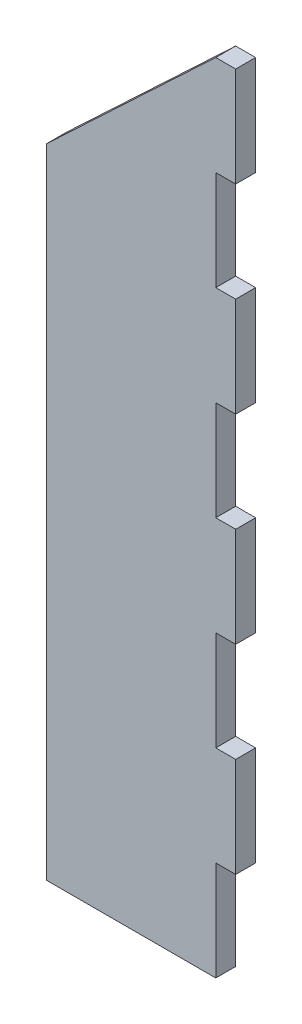
ISO-10303-21;
HEADER;
FILE_DESCRIPTION(('STEP AP214'),'2;1');
FILE_NAME('part.step','',(''),(''),'','','');
FILE_SCHEMA(('AUTOMOTIVE_DESIGN { 1 0 10303 214 1 1 1 1 }'));
ENDSEC;
DATA;
#1=APPLICATION_CONTEXT('core data for automotive mechanical design processes');
#2=APPLICATION_PROTOCOL_DEFINITION('international standard','automotive_design',2000,#1);
#3=PRODUCT_CONTEXT('',#1,'mechanical');
#4=PRODUCT('Part','Part','',(#3));
#5=PRODUCT_RELATED_PRODUCT_CATEGORY('part','',(#4));
#6=PRODUCT_DEFINITION_FORMATION('','',#4);
#7=PRODUCT_DEFINITION_CONTEXT('part definition',#1,'design');
#8=PRODUCT_DEFINITION('design','',#6,#7);
#9=PRODUCT_DEFINITION_SHAPE('','',#8);
#10=(LENGTH_UNIT() NAMED_UNIT(*) SI_UNIT(.MILLI.,.METRE.));
#11=(NAMED_UNIT(*) PLANE_ANGLE_UNIT() SI_UNIT($,.RADIAN.));
#12=(NAMED_UNIT(*) SI_UNIT($,.STERADIAN.) SOLID_ANGLE_UNIT());
#13=UNCERTAINTY_MEASURE_WITH_UNIT(LENGTH_MEASURE(1.E-05),#10,'distance_accuracy_value','');
#14=(GEOMETRIC_REPRESENTATION_CONTEXT(3) GLOBAL_UNCERTAINTY_ASSIGNED_CONTEXT((#13)) GLOBAL_UNIT_ASSIGNED_CONTEXT((#10,
#11,#12)) REPRESENTATION_CONTEXT('',''));
#15=CARTESIAN_POINT('',(0.,0.,0.));
#16=DIRECTION('',(0.,0.,1.));
#17=DIRECTION('',(1.,0.,0.));
#18=AXIS2_PLACEMENT_3D('',#15,#16,#17);
#19=CARTESIAN_POINT('',(-2.7755575615629E-13,25.3999999999997,6.35));
#20=DIRECTION('',(0.,1.,0.));
#21=DIRECTION('',(-1.,0.,0.));
#22=AXIS2_PLACEMENT_3D('',#19,#20,#21);
#23=PLANE('',#22);
#24=DIRECTION('',(1.,0.,0.));
#25=VECTOR('',#24,1.);
#26=CARTESIAN_POINT('',(-2.7755575615629E-13,25.3999999999997,0.));
#27=LINE('',#26,#25);
#28=CARTESIAN_POINT('',(26.9875,25.4,0.));
#29=VERTEX_POINT('',#28);
#30=CARTESIAN_POINT('',(33.337500000001,25.4,0.));
#31=VERTEX_POINT('',#30);
#32=EDGE_CURVE('E234',#29,#31,#27,.T.);
#33=ORIENTED_EDGE('',*,*,#32,.F.);
#34=DIRECTION('',(0.,0.,-1.));
#35=VECTOR('',#34,1.);
#36=CARTESIAN_POINT('',(26.9875,25.4,6.35));
#37=LINE('',#36,#35);
#38=CARTESIAN_POINT('',(26.9875,25.4,6.35));
#39=VERTEX_POINT('',#38);
#40=EDGE_CURVE('E11',#39,#29,#37,.T.);
#41=ORIENTED_EDGE('',*,*,#40,.F.);
#42=DIRECTION('',(1.,0.,0.));
#43=VECTOR('',#42,1.);
#44=CARTESIAN_POINT('',(-2.7755575615629E-13,25.3999999999997,6.35));
#45=LINE('',#44,#43);
#46=CARTESIAN_POINT('',(33.337500000001,25.4,6.35));
#47=VERTEX_POINT('',#46);
#48=EDGE_CURVE('E230',#39,#47,#45,.T.);
#49=ORIENTED_EDGE('',*,*,#48,.T.);
#50=DIRECTION('',(0.,0.,-1.));
#51=VECTOR('',#50,1.);
#52=CARTESIAN_POINT('',(33.337500000001,25.4,6.35));
#53=LINE('',#52,#51);
#54=EDGE_CURVE('E50',#47,#31,#53,.T.);
#55=ORIENTED_EDGE('',*,*,#54,.T.);
#56=EDGE_LOOP('',(#33,#41,#49,#55));
#57=FACE_BOUND('',#56,.T.);
#58=ADVANCED_FACE('F34',(#57),#23,.T.);
#59=CARTESIAN_POINT('',(26.9875,0.,6.35));
#60=DIRECTION('',(1.,0.,0.));
#61=DIRECTION('',(0.,1.,0.));
#62=AXIS2_PLACEMENT_3D('',#59,#60,#61);
#63=PLANE('',#62);
#64=DIRECTION('',(0.,-1.,0.));
#65=VECTOR('',#64,1.);
#66=CARTESIAN_POINT('',(26.9875,0.,0.));
#67=LINE('',#66,#65);
#68=CARTESIAN_POINT('',(26.9875,57.15,0.));
#69=VERTEX_POINT('',#68);
#70=EDGE_CURVE('E237',#69,#29,#67,.T.);
#71=ORIENTED_EDGE('',*,*,#70,.F.);
#72=DIRECTION('',(0.,0.,-1.));
#73=VECTOR('',#72,1.);
#74=CARTESIAN_POINT('',(26.9875,57.15,6.35));
#75=LINE('',#74,#73);
#76=CARTESIAN_POINT('',(26.9875,57.15,6.35));
#77=VERTEX_POINT('',#76);
#78=EDGE_CURVE('E42',#77,#69,#75,.T.);
#79=ORIENTED_EDGE('',*,*,#78,.F.);
#80=DIRECTION('',(0.,-1.,0.));
#81=VECTOR('',#80,1.);
#82=CARTESIAN_POINT('',(26.9875,0.,6.35));
#83=LINE('',#82,#81);
#84=EDGE_CURVE('E227',#77,#39,#83,.T.);
#85=ORIENTED_EDGE('',*,*,#84,.T.);
#86=ORIENTED_EDGE('',*,*,#40,.T.);
#87=EDGE_LOOP('',(#71,#79,#85,#86));
#88=FACE_BOUND('',#87,.T.);
#89=ADVANCED_FACE('F323',(#88),#63,.T.);
#90=CARTESIAN_POINT('',(-3.74700270810996E-13,57.1499999999998,6.35));
#91=DIRECTION('',(0.,1.,0.));
#92=DIRECTION('',(-1.,0.,0.));
#93=AXIS2_PLACEMENT_3D('',#90,#91,#92);
#94=PLANE('',#93);
#95=DIRECTION('',(1.,0.,0.));
#96=VECTOR('',#95,1.);
#97=CARTESIAN_POINT('',(-3.74700270810996E-13,57.1499999999998,0.));
#98=LINE('',#97,#96);
#99=CARTESIAN_POINT('',(33.3375000000006,57.15,0.));
#100=VERTEX_POINT('',#99);
#101=EDGE_CURVE('E242',#69,#100,#98,.T.);
#102=ORIENTED_EDGE('',*,*,#101,.T.);
#103=DIRECTION('',(0.,0.,-1.));
#104=VECTOR('',#103,1.);
#105=CARTESIAN_POINT('',(33.3375000000006,57.15,6.35));
#106=LINE('',#105,#104);
#107=CARTESIAN_POINT('',(33.3375000000006,57.15,6.35));
#108=VERTEX_POINT('',#107);
#109=EDGE_CURVE('E312',#108,#100,#106,.T.);
#110=ORIENTED_EDGE('',*,*,#109,.F.);
#111=DIRECTION('',(1.,0.,0.));
#112=VECTOR('',#111,1.);
#113=CARTESIAN_POINT('',(-3.74700270810996E-13,57.1499999999998,6.35));
#114=LINE('',#113,#112);
#115=EDGE_CURVE('E225',#77,#108,#114,.T.);
#116=ORIENTED_EDGE('',*,*,#115,.F.);
#117=ORIENTED_EDGE('',*,*,#78,.T.);
#118=EDGE_LOOP('',(#102,#110,#116,#117));
#119=FACE_BOUND('',#118,.T.);
#120=ADVANCED_FACE('F316',(#119),#94,.F.);
#121=CARTESIAN_POINT('',(33.3375000000005,0.,6.35));
#122=DIRECTION('',(1.,0.,0.));
#123=DIRECTION('',(0.,1.,0.));
#124=AXIS2_PLACEMENT_3D('',#121,#122,#123);
#125=PLANE('',#124);
#126=DIRECTION('',(0.,-1.,0.));
#127=VECTOR('',#126,1.);
#128=CARTESIAN_POINT('',(33.3375000000005,0.,0.));
#129=LINE('',#128,#127);
#130=CARTESIAN_POINT('',(33.3375000000003,88.9,0.));
#131=VERTEX_POINT('',#130);
#132=EDGE_CURVE('E249',#131,#100,#129,.T.);
#133=ORIENTED_EDGE('',*,*,#132,.F.);
#134=DIRECTION('',(0.,0.,-1.));
#135=VECTOR('',#134,1.);
#136=CARTESIAN_POINT('',(33.3375000000003,88.9,6.35));
#137=LINE('',#136,#135);
#138=CARTESIAN_POINT('',(33.3375000000003,88.9,6.35));
#139=VERTEX_POINT('',#138);
#140=EDGE_CURVE('E310',#139,#131,#137,.T.);
#141=ORIENTED_EDGE('',*,*,#140,.F.);
#142=DIRECTION('',(0.,-1.,0.));
#143=VECTOR('',#142,1.);
#144=CARTESIAN_POINT('',(33.3375000000005,0.,6.35));
#145=LINE('',#144,#143);
#146=EDGE_CURVE('E222',#139,#108,#145,.T.);
#147=ORIENTED_EDGE('',*,*,#146,.T.);
#148=ORIENTED_EDGE('',*,*,#109,.T.);
#149=EDGE_LOOP('',(#133,#141,#147,#148));
#150=FACE_BOUND('',#149,.T.);
#151=ADVANCED_FACE('F333',(#150),#125,.T.);
#152=CARTESIAN_POINT('',(-1.94289029309406E-13,88.8999999999999,6.35));
#153=DIRECTION('',(0.,1.,0.));
#154=DIRECTION('',(-1.,0.,0.));
#155=AXIS2_PLACEMENT_3D('',#152,#153,#154);
#156=PLANE('',#155);
#157=DIRECTION('',(1.,0.,0.));
#158=VECTOR('',#157,1.);
#159=CARTESIAN_POINT('',(-1.94289029309406E-13,88.8999999999999,0.));
#160=LINE('',#159,#158);
#161=CARTESIAN_POINT('',(26.9875,88.9,0.));
#162=VERTEX_POINT('',#161);
#163=EDGE_CURVE('E252',#162,#131,#160,.T.);
#164=ORIENTED_EDGE('',*,*,#163,.F.);
#165=DIRECTION('',(0.,0.,-1.));
#166=VECTOR('',#165,1.);
#167=CARTESIAN_POINT('',(26.9875,88.9,6.35));
#168=LINE('',#167,#166);
#169=CARTESIAN_POINT('',(26.9875,88.9,6.35));
#170=VERTEX_POINT('',#169);
#171=EDGE_CURVE('E308',#170,#162,#168,.T.);
#172=ORIENTED_EDGE('',*,*,#171,.F.);
#173=DIRECTION('',(1.,0.,0.));
#174=VECTOR('',#173,1.);
#175=CARTESIAN_POINT('',(-1.94289029309406E-13,88.8999999999999,6.35));
#176=LINE('',#175,#174);
#177=EDGE_CURVE('E219',#170,#139,#176,.T.);
#178=ORIENTED_EDGE('',*,*,#177,.T.);
#179=ORIENTED_EDGE('',*,*,#140,.T.);
#180=EDGE_LOOP('',(#164,#172,#178,#179));
#181=FACE_BOUND('',#180,.T.);
#182=ADVANCED_FACE('F338',(#181),#156,.T.);
#183=CARTESIAN_POINT('',(26.9875,120.65,0.));
#184=VERTEX_POINT('',#183);
#185=EDGE_CURVE('E244',#184,#162,#67,.T.);
#186=ORIENTED_EDGE('',*,*,#185,.F.);
#187=DIRECTION('',(0.,0.,-1.));
#188=VECTOR('',#187,1.);
#189=CARTESIAN_POINT('',(26.9875,120.65,6.35));
#190=LINE('',#189,#188);
#191=CARTESIAN_POINT('',(26.9875,120.65,6.35));
#192=VERTEX_POINT('',#191);
#193=EDGE_CURVE('E306',#192,#184,#190,.T.);
#194=ORIENTED_EDGE('',*,*,#193,.F.);
#195=EDGE_CURVE('E218',#192,#170,#83,.T.);
#196=ORIENTED_EDGE('',*,*,#195,.T.);
#197=ORIENTED_EDGE('',*,*,#171,.T.);
#198=EDGE_LOOP('',(#186,#194,#196,#197));
#199=FACE_BOUND('',#198,.T.);
#200=ADVANCED_FACE('F329',(#199),#63,.T.);
#201=CARTESIAN_POINT('',(-1.3183898417425E-12,120.65,6.35));
#202=DIRECTION('',(0.,1.,0.));
#203=DIRECTION('',(-1.,0.,0.));
#204=AXIS2_PLACEMENT_3D('',#201,#202,#203);
#205=PLANE('',#204);
#206=DIRECTION('',(1.,0.,0.));
#207=VECTOR('',#206,1.);
#208=CARTESIAN_POINT('',(-1.3183898417425E-12,120.65,0.));
#209=LINE('',#208,#207);
#210=CARTESIAN_POINT('',(33.3375,120.65,0.));
#211=VERTEX_POINT('',#210);
#212=EDGE_CURVE('E255',#184,#211,#209,.T.);
#213=ORIENTED_EDGE('',*,*,#212,.T.);
#214=DIRECTION('',(0.,0.,-1.));
#215=VECTOR('',#214,1.);
#216=CARTESIAN_POINT('',(33.3375,120.65,6.35));
#217=LINE('',#216,#215);
#218=CARTESIAN_POINT('',(33.3375,120.65,6.35));
#219=VERTEX_POINT('',#218);
#220=EDGE_CURVE('E304',#219,#211,#217,.T.);
#221=ORIENTED_EDGE('',*,*,#220,.F.);
#222=DIRECTION('',(1.,0.,0.));
#223=VECTOR('',#222,1.);
#224=CARTESIAN_POINT('',(-1.3183898417425E-12,120.65,6.35));
#225=LINE('',#224,#223);
#226=EDGE_CURVE('E216',#192,#219,#225,.T.);
#227=ORIENTED_EDGE('',*,*,#226,.F.);
#228=ORIENTED_EDGE('',*,*,#193,.T.);
#229=EDGE_LOOP('',(#213,#221,#227,#228));
#230=FACE_BOUND('',#229,.T.);
#231=ADVANCED_FACE('F337',(#230),#205,.F.);
#232=CARTESIAN_POINT('',(33.3374999999998,0.,6.35));
#233=DIRECTION('',(1.,0.,0.));
#234=DIRECTION('',(0.,1.,0.));
#235=AXIS2_PLACEMENT_3D('',#232,#233,#234);
#236=PLANE('',#235);
#237=DIRECTION('',(0.,-1.,0.));
#238=VECTOR('',#237,1.);
#239=CARTESIAN_POINT('',(33.3374999999998,0.,0.));
#240=LINE('',#239,#238);
#241=CARTESIAN_POINT('',(33.3375,152.4,0.));
#242=VERTEX_POINT('',#241);
#243=EDGE_CURVE('E258',#242,#211,#240,.T.);
#244=ORIENTED_EDGE('',*,*,#243,.F.);
#245=DIRECTION('',(0.,0.,-1.));
#246=VECTOR('',#245,1.);
#247=CARTESIAN_POINT('',(33.3375,152.4,6.35));
#248=LINE('',#247,#246);
#249=CARTESIAN_POINT('',(33.3375,152.4,6.35));
#250=VERTEX_POINT('',#249);
#251=EDGE_CURVE('E302',#250,#242,#248,.T.);
#252=ORIENTED_EDGE('',*,*,#251,.F.);
#253=DIRECTION('',(0.,-1.,0.));
#254=VECTOR('',#253,1.);
#255=CARTESIAN_POINT('',(33.3374999999998,0.,6.35));
#256=LINE('',#255,#254);
#257=EDGE_CURVE('E213',#250,#219,#256,.T.);
#258=ORIENTED_EDGE('',*,*,#257,.T.);
#259=ORIENTED_EDGE('',*,*,#220,.T.);
#260=EDGE_LOOP('',(#244,#252,#258,#259));
#261=FACE_BOUND('',#260,.T.);
#262=ADVANCED_FACE('F344',(#261),#236,.T.);
#263=CARTESIAN_POINT('',(0.,152.4,6.35));
#264=DIRECTION('',(0.,1.,0.));
#265=DIRECTION('',(0.,0.,1.));
#266=AXIS2_PLACEMENT_3D('',#263,#264,#265);
#267=PLANE('',#266);
#268=DIRECTION('',(1.,0.,0.));
#269=VECTOR('',#268,1.);
#270=CARTESIAN_POINT('',(0.,152.4,0.));
#271=LINE('',#270,#269);
#272=CARTESIAN_POINT('',(26.9875,152.4,0.));
#273=VERTEX_POINT('',#272);
#274=EDGE_CURVE('E261',#273,#242,#271,.T.);
#275=ORIENTED_EDGE('',*,*,#274,.F.);
#276=DIRECTION('',(0.,0.,-1.));
#277=VECTOR('',#276,1.);
#278=CARTESIAN_POINT('',(26.9875,152.4,6.35));
#279=LINE('',#278,#277);
#280=CARTESIAN_POINT('',(26.9875,152.4,6.35));
#281=VERTEX_POINT('',#280);
#282=EDGE_CURVE('E300',#281,#273,#279,.T.);
#283=ORIENTED_EDGE('',*,*,#282,.F.);
#284=DIRECTION('',(1.,0.,0.));
#285=VECTOR('',#284,1.);
#286=CARTESIAN_POINT('',(0.,152.4,6.35));
#287=LINE('',#286,#285);
#288=EDGE_CURVE('E210',#281,#250,#287,.T.);
#289=ORIENTED_EDGE('',*,*,#288,.T.);
#290=ORIENTED_EDGE('',*,*,#251,.T.);
#291=EDGE_LOOP('',(#275,#283,#289,#290));
#292=FACE_BOUND('',#291,.T.);
#293=ADVANCED_FACE('F393',(#292),#267,.T.);
#294=CARTESIAN_POINT('',(-63.3834862385321,67.3449541284404,6.35));
#295=DIRECTION('',(-0.685364699004991,0.728199992692803,0.));
#296=DIRECTION('',(-0.728199992692803,-0.685364699004991,0.));
#297=AXIS2_PLACEMENT_3D('',#294,#295,#296);
#298=PLANE('',#297);
#299=DIRECTION('',(0.728199992692803,0.685364699004991,0.));
#300=VECTOR('',#299,1.);
#301=CARTESIAN_POINT('',(-63.3834862385321,67.3449541284404,0.));
#302=LINE('',#301,#300);
#303=CARTESIAN_POINT('',(-26.9875,101.6,0.));
#304=VERTEX_POINT('',#303);
#305=EDGE_CURVE('E264',#304,#273,#302,.T.);
#306=ORIENTED_EDGE('',*,*,#305,.F.);
#307=DIRECTION('',(0.,0.,-1.));
#308=VECTOR('',#307,1.);
#309=CARTESIAN_POINT('',(-26.9875,101.6,6.35));
#310=LINE('',#309,#308);
#311=CARTESIAN_POINT('',(-26.9875,101.6,6.35));
#312=VERTEX_POINT('',#311);
#313=EDGE_CURVE('E298',#312,#304,#310,.T.);
#314=ORIENTED_EDGE('',*,*,#313,.F.);
#315=DIRECTION('',(0.728199992692803,0.685364699004991,0.));
#316=VECTOR('',#315,1.);
#317=CARTESIAN_POINT('',(-63.3834862385321,67.3449541284404,6.35));
#318=LINE('',#317,#316);
#319=EDGE_CURVE('E205',#312,#281,#318,.T.);
#320=ORIENTED_EDGE('',*,*,#319,.T.);
#321=ORIENTED_EDGE('',*,*,#282,.T.);
#322=EDGE_LOOP('',(#306,#314,#320,#321));
#323=FACE_BOUND('',#322,.T.);
#324=ADVANCED_FACE('F403',(#323),#298,.T.);
#325=CARTESIAN_POINT('',(-26.9875,0.,6.35));
#326=DIRECTION('',(-1.,0.,0.));
#327=DIRECTION('',(0.,-1.,0.));
#328=AXIS2_PLACEMENT_3D('',#325,#326,#327);
#329=PLANE('',#328);
#330=DIRECTION('',(0.,1.,0.));
#331=VECTOR('',#330,1.);
#332=CARTESIAN_POINT('',(-26.9875,0.,0.));
#333=LINE('',#332,#331);
#334=CARTESIAN_POINT('',(-26.9875,-101.6,0.));
#335=VERTEX_POINT('',#334);
#336=EDGE_CURVE('E267',#335,#304,#333,.T.);
#337=ORIENTED_EDGE('',*,*,#336,.F.);
#338=DIRECTION('',(0.,0.,-1.));
#339=VECTOR('',#338,1.);
#340=CARTESIAN_POINT('',(-26.9875,-101.6,6.35));
#341=LINE('',#340,#339);
#342=CARTESIAN_POINT('',(-26.9875,-101.6,6.35));
#343=VERTEX_POINT('',#342);
#344=EDGE_CURVE('E296',#343,#335,#341,.T.);
#345=ORIENTED_EDGE('',*,*,#344,.F.);
#346=DIRECTION('',(0.,1.,0.));
#347=VECTOR('',#346,1.);
#348=CARTESIAN_POINT('',(-26.9875,0.,6.35));
#349=LINE('',#348,#347);
#350=EDGE_CURVE('E201',#343,#312,#349,.T.);
#351=ORIENTED_EDGE('',*,*,#350,.T.);
#352=ORIENTED_EDGE('',*,*,#313,.T.);
#353=EDGE_LOOP('',(#337,#345,#351,#352));
#354=FACE_BOUND('',#353,.T.);
#355=ADVANCED_FACE('F413',(#354),#329,.T.);
#356=CARTESIAN_POINT('',(1.30614473485313E-13,-101.6,6.35));
#357=DIRECTION('',(0.,-1.,0.));
#358=DIRECTION('',(1.,0.,0.));
#359=AXIS2_PLACEMENT_3D('',#356,#357,#358);
#360=PLANE('',#359);
#361=DIRECTION('',(-1.,0.,0.));
#362=VECTOR('',#361,1.);
#363=CARTESIAN_POINT('',(1.30614473485313E-13,-101.6,0.));
#364=LINE('',#363,#362);
#365=CARTESIAN_POINT('',(26.9875,-101.6,0.));
#366=VERTEX_POINT('',#365);
#367=EDGE_CURVE('E270',#366,#335,#364,.T.);
#368=ORIENTED_EDGE('',*,*,#367,.F.);
#369=DIRECTION('',(0.,0.,-1.));
#370=VECTOR('',#369,1.);
#371=CARTESIAN_POINT('',(26.9875,-101.6,20.5490316571237));
#372=LINE('',#371,#370);
#373=CARTESIAN_POINT('',(26.9875,-101.6,6.35));
#374=VERTEX_POINT('',#373);
#375=EDGE_CURVE('E233',#374,#366,#372,.T.);
#376=ORIENTED_EDGE('',*,*,#375,.F.);
#377=DIRECTION('',(-1.,0.,0.));
#378=VECTOR('',#377,1.);
#379=CARTESIAN_POINT('',(1.30614473485313E-13,-101.6,6.35));
#380=LINE('',#379,#378);
#381=EDGE_CURVE('E195',#374,#343,#380,.T.);
#382=ORIENTED_EDGE('',*,*,#381,.T.);
#383=ORIENTED_EDGE('',*,*,#344,.T.);
#384=EDGE_LOOP('',(#368,#376,#382,#383));
#385=FACE_BOUND('',#384,.T.);
#386=ADVANCED_FACE('F423',(#385),#360,.T.);
#387=CARTESIAN_POINT('',(26.9875,0.,6.35));
#388=DIRECTION('',(1.,0.,0.));
#389=DIRECTION('',(0.,1.,0.));
#390=AXIS2_PLACEMENT_3D('',#387,#388,#389);
#391=PLANE('',#390);
#392=ORIENTED_EDGE('',*,*,#375,.T.);
#393=DIRECTION('',(0.,-1.,0.));
#394=VECTOR('',#393,1.);
#395=CARTESIAN_POINT('',(26.9875,0.,0.));
#396=LINE('',#395,#394);
#397=CARTESIAN_POINT('',(26.9875,-69.8500000000001,0.));
#398=VERTEX_POINT('',#397);
#399=EDGE_CURVE('E273',#398,#366,#396,.T.);
#400=ORIENTED_EDGE('',*,*,#399,.F.);
#401=DIRECTION('',(0.,0.,-1.));
#402=VECTOR('',#401,1.);
#403=CARTESIAN_POINT('',(26.9875,-69.8500000000001,6.35));
#404=LINE('',#403,#402);
#405=CARTESIAN_POINT('',(26.9875,-69.8500000000001,6.35));
#406=VERTEX_POINT('',#405);
#407=EDGE_CURVE('E294',#406,#398,#404,.T.);
#408=ORIENTED_EDGE('',*,*,#407,.F.);
#409=DIRECTION('',(0.,-1.,0.));
#410=VECTOR('',#409,1.);
#411=CARTESIAN_POINT('',(26.9875,0.,6.35));
#412=LINE('',#411,#410);
#413=EDGE_CURVE('E188',#406,#374,#412,.T.);
#414=ORIENTED_EDGE('',*,*,#413,.T.);
#415=EDGE_LOOP('',(#392,#400,#408,#414));
#416=FACE_BOUND('',#415,.T.);
#417=ADVANCED_FACE('F437',(#416),#391,.T.);
#418=CARTESIAN_POINT('',(1.67921232474506E-12,-69.8500000000007,6.35));
#419=DIRECTION('',(0.,1.,0.));
#420=DIRECTION('',(-1.,0.,0.));
#421=AXIS2_PLACEMENT_3D('',#418,#419,#420);
#422=PLANE('',#421);
#423=DIRECTION('',(1.,0.,0.));
#424=VECTOR('',#423,1.);
#425=CARTESIAN_POINT('',(1.67921232474506E-12,-69.8500000000007,0.));
#426=LINE('',#425,#424);
#427=CARTESIAN_POINT('',(33.3375000000019,-69.8499999999999,0.));
#428=VERTEX_POINT('',#427);
#429=EDGE_CURVE('E275',#398,#428,#426,.T.);
#430=ORIENTED_EDGE('',*,*,#429,.T.);
#431=DIRECTION('',(0.,0.,-1.));
#432=VECTOR('',#431,1.);
#433=CARTESIAN_POINT('',(33.3375000000019,-69.8499999999999,6.35));
#434=LINE('',#433,#432);
#435=CARTESIAN_POINT('',(33.3375000000019,-69.8499999999999,6.35));
#436=VERTEX_POINT('',#435);
#437=EDGE_CURVE('E292',#436,#428,#434,.T.);
#438=ORIENTED_EDGE('',*,*,#437,.F.);
#439=DIRECTION('',(1.,0.,0.));
#440=VECTOR('',#439,1.);
#441=CARTESIAN_POINT('',(1.67921232474506E-12,-69.8500000000007,6.35));
#442=LINE('',#441,#440);
#443=EDGE_CURVE('E194',#406,#436,#442,.T.);
#444=ORIENTED_EDGE('',*,*,#443,.F.);
#445=ORIENTED_EDGE('',*,*,#407,.T.);
#446=EDGE_LOOP('',(#430,#438,#444,#445));
#447=FACE_BOUND('',#446,.T.);
#448=ADVANCED_FACE('F431',(#447),#422,.F.);
#449=CARTESIAN_POINT('',(33.337500000002,0.,6.35));
#450=DIRECTION('',(1.,0.,0.));
#451=DIRECTION('',(0.,1.,0.));
#452=AXIS2_PLACEMENT_3D('',#449,#450,#451);
#453=PLANE('',#452);
#454=DIRECTION('',(0.,-1.,0.));
#455=VECTOR('',#454,1.);
#456=CARTESIAN_POINT('',(33.337500000002,0.,0.));
#457=LINE('',#456,#455);
#458=CARTESIAN_POINT('',(33.3375000000016,-38.1,0.));
#459=VERTEX_POINT('',#458);
#460=EDGE_CURVE('E278',#459,#428,#457,.T.);
#461=ORIENTED_EDGE('',*,*,#460,.F.);
#462=DIRECTION('',(0.,0.,-1.));
#463=VECTOR('',#462,1.);
#464=CARTESIAN_POINT('',(33.3375000000016,-38.1,6.35));
#465=LINE('',#464,#463);
#466=CARTESIAN_POINT('',(33.3375000000016,-38.1,6.35));
#467=VERTEX_POINT('',#466);
#468=EDGE_CURVE('E290',#467,#459,#465,.T.);
#469=ORIENTED_EDGE('',*,*,#468,.F.);
#470=DIRECTION('',(0.,-1.,0.));
#471=VECTOR('',#470,1.);
#472=CARTESIAN_POINT('',(33.337500000002,0.,6.35));
#473=LINE('',#472,#471);
#474=EDGE_CURVE('E189',#467,#436,#473,.T.);
#475=ORIENTED_EDGE('',*,*,#474,.T.);
#476=ORIENTED_EDGE('',*,*,#437,.T.);
#477=EDGE_LOOP('',(#461,#469,#475,#476));
#478=FACE_BOUND('',#477,.T.);
#479=ADVANCED_FACE('F436',(#478),#453,.T.);
#480=CARTESIAN_POINT('',(5.82867087928225E-13,-38.1000000000005,6.35));
#481=DIRECTION('',(0.,1.,0.));
#482=DIRECTION('',(-1.,0.,0.));
#483=AXIS2_PLACEMENT_3D('',#480,#481,#482);
#484=PLANE('',#483);
#485=DIRECTION('',(1.,0.,0.));
#486=VECTOR('',#485,1.);
#487=CARTESIAN_POINT('',(5.82867087928225E-13,-38.1000000000005,0.));
#488=LINE('',#487,#486);
#489=CARTESIAN_POINT('',(26.9875,-38.1000000000001,0.));
#490=VERTEX_POINT('',#489);
#491=EDGE_CURVE('E281',#490,#459,#488,.T.);
#492=ORIENTED_EDGE('',*,*,#491,.F.);
#493=DIRECTION('',(0.,0.,-1.));
#494=VECTOR('',#493,1.);
#495=CARTESIAN_POINT('',(26.9875,-38.1000000000001,6.35));
#496=LINE('',#495,#494);
#497=CARTESIAN_POINT('',(26.9875,-38.1000000000001,6.35));
#498=VERTEX_POINT('',#497);
#499=EDGE_CURVE('E173',#498,#490,#496,.T.);
#500=ORIENTED_EDGE('',*,*,#499,.F.);
#501=DIRECTION('',(1.,0.,0.));
#502=VECTOR('',#501,1.);
#503=CARTESIAN_POINT('',(5.82867087928225E-13,-38.1000000000005,6.35));
#504=LINE('',#503,#502);
#505=EDGE_CURVE('E186',#498,#467,#504,.T.);
#506=ORIENTED_EDGE('',*,*,#505,.T.);
#507=ORIENTED_EDGE('',*,*,#468,.T.);
#508=EDGE_LOOP('',(#492,#500,#506,#507));
#509=FACE_BOUND('',#508,.T.);
#510=ADVANCED_FACE('F449',(#509),#484,.T.);
#511=CARTESIAN_POINT('',(26.9875,-6.35000000000005,0.));
#512=VERTEX_POINT('',#511);
#513=EDGE_CURVE('E170',#512,#490,#396,.T.);
#514=ORIENTED_EDGE('',*,*,#513,.F.);
#515=DIRECTION('',(0.,0.,-1.));
#516=VECTOR('',#515,1.);
#517=CARTESIAN_POINT('',(26.9875,-6.35000000000005,6.35));
#518=LINE('',#517,#516);
#519=CARTESIAN_POINT('',(26.9875,-6.35000000000005,6.35));
#520=VERTEX_POINT('',#519);
#521=EDGE_CURVE('E164',#520,#512,#518,.T.);
#522=ORIENTED_EDGE('',*,*,#521,.F.);
#523=EDGE_CURVE('E168',#520,#498,#412,.T.);
#524=ORIENTED_EDGE('',*,*,#523,.T.);
#525=ORIENTED_EDGE('',*,*,#499,.T.);
#526=EDGE_LOOP('',(#514,#522,#524,#525));
#527=FACE_BOUND('',#526,.T.);
#528=ADVANCED_FACE('F166',(#527),#391,.T.);
#529=CARTESIAN_POINT('',(0.,-6.35000000000046,6.35));
#530=DIRECTION('',(0.,1.,0.));
#531=DIRECTION('',(-1.,0.,0.));
#532=AXIS2_PLACEMENT_3D('',#529,#530,#531);
#533=PLANE('',#532);
#534=DIRECTION('',(1.,0.,0.));
#535=VECTOR('',#534,1.);
#536=CARTESIAN_POINT('',(0.,-6.35000000000046,0.));
#537=LINE('',#536,#535);
#538=CARTESIAN_POINT('',(33.3375000000013,-6.34999999999995,0.));
#539=VERTEX_POINT('',#538);
#540=EDGE_CURVE('E284',#512,#539,#537,.T.);
#541=ORIENTED_EDGE('',*,*,#540,.T.);
#542=DIRECTION('',(0.,0.,-1.));
#543=VECTOR('',#542,1.);
#544=CARTESIAN_POINT('',(33.3375000000013,-6.34999999999995,6.35));
#545=LINE('',#544,#543);
#546=CARTESIAN_POINT('',(33.3375000000013,-6.34999999999995,6.35));
#547=VERTEX_POINT('',#546);
#548=EDGE_CURVE('E107',#547,#539,#545,.T.);
#549=ORIENTED_EDGE('',*,*,#548,.F.);
#550=DIRECTION('',(1.,0.,0.));
#551=VECTOR('',#550,1.);
#552=CARTESIAN_POINT('',(0.,-6.35000000000046,6.35));
#553=LINE('',#552,#551);
#554=EDGE_CURVE('E175',#520,#547,#553,.T.);
#555=ORIENTED_EDGE('',*,*,#554,.F.);
#556=ORIENTED_EDGE('',*,*,#521,.T.);
#557=EDGE_LOOP('',(#541,#549,#555,#556));
#558=FACE_BOUND('',#557,.T.);
#559=ADVANCED_FACE('F176',(#558),#533,.F.);
#560=CARTESIAN_POINT('',(33.3375000000013,0.,6.35));
#561=DIRECTION('',(1.,0.,0.));
#562=DIRECTION('',(0.,1.,0.));
#563=AXIS2_PLACEMENT_3D('',#560,#561,#562);
#564=PLANE('',#563);
#565=DIRECTION('',(0.,-1.,0.));
#566=VECTOR('',#565,1.);
#567=CARTESIAN_POINT('',(33.3375000000013,0.,0.));
#568=LINE('',#567,#566);
#569=EDGE_CURVE('E232',#31,#539,#568,.T.);
#570=ORIENTED_EDGE('',*,*,#569,.F.);
#571=ORIENTED_EDGE('',*,*,#54,.F.);
#572=DIRECTION('',(0.,-1.,0.));
#573=VECTOR('',#572,1.);
#574=CARTESIAN_POINT('',(33.3375000000013,0.,6.35));
#575=LINE('',#574,#573);
#576=EDGE_CURVE('E179',#47,#547,#575,.T.);
#577=ORIENTED_EDGE('',*,*,#576,.T.);
#578=ORIENTED_EDGE('',*,*,#548,.T.);
#579=EDGE_LOOP('',(#570,#571,#577,#578));
#580=FACE_BOUND('',#579,.T.);
#581=ADVANCED_FACE('F480',(#580),#564,.T.);
#582=CARTESIAN_POINT('',(0.,0.,6.35));
#583=DIRECTION('',(0.,0.,1.));
#584=DIRECTION('',(1.,0.,0.));
#585=AXIS2_PLACEMENT_3D('',#582,#583,#584);
#586=PLANE('',#585);
#587=ORIENTED_EDGE('',*,*,#381,.F.);
#588=ORIENTED_EDGE('',*,*,#413,.F.);
#589=ORIENTED_EDGE('',*,*,#443,.T.);
#590=ORIENTED_EDGE('',*,*,#474,.F.);
#591=ORIENTED_EDGE('',*,*,#505,.F.);
#592=ORIENTED_EDGE('',*,*,#523,.F.);
#593=ORIENTED_EDGE('',*,*,#554,.T.);
#594=ORIENTED_EDGE('',*,*,#576,.F.);
#595=ORIENTED_EDGE('',*,*,#48,.F.);
#596=ORIENTED_EDGE('',*,*,#84,.F.);
#597=ORIENTED_EDGE('',*,*,#115,.T.);
#598=ORIENTED_EDGE('',*,*,#146,.F.);
#599=ORIENTED_EDGE('',*,*,#177,.F.);
#600=ORIENTED_EDGE('',*,*,#195,.F.);
#601=ORIENTED_EDGE('',*,*,#226,.T.);
#602=ORIENTED_EDGE('',*,*,#257,.F.);
#603=ORIENTED_EDGE('',*,*,#288,.F.);
#604=ORIENTED_EDGE('',*,*,#319,.F.);
#605=ORIENTED_EDGE('',*,*,#350,.F.);
#606=EDGE_LOOP('',(#587,#588,#589,#590,#591,#592,#593,#594,#595,#596,#597,#598,#599,#600,#601,
#602,#603,#604,#605));
#607=FACE_BOUND('',#606,.T.);
#608=ADVANCED_FACE('F183',(#607),#586,.T.);
#609=CARTESIAN_POINT('',(0.,0.,0.));
#610=DIRECTION('',(0.,0.,1.));
#611=DIRECTION('',(1.,0.,0.));
#612=AXIS2_PLACEMENT_3D('',#609,#610,#611);
#613=PLANE('',#612);
#614=ORIENTED_EDGE('',*,*,#399,.T.);
#615=ORIENTED_EDGE('',*,*,#367,.T.);
#616=ORIENTED_EDGE('',*,*,#336,.T.);
#617=ORIENTED_EDGE('',*,*,#305,.T.);
#618=ORIENTED_EDGE('',*,*,#274,.T.);
#619=ORIENTED_EDGE('',*,*,#243,.T.);
#620=ORIENTED_EDGE('',*,*,#212,.F.);
#621=ORIENTED_EDGE('',*,*,#185,.T.);
#622=ORIENTED_EDGE('',*,*,#163,.T.);
#623=ORIENTED_EDGE('',*,*,#132,.T.);
#624=ORIENTED_EDGE('',*,*,#101,.F.);
#625=ORIENTED_EDGE('',*,*,#70,.T.);
#626=ORIENTED_EDGE('',*,*,#32,.T.);
#627=ORIENTED_EDGE('',*,*,#569,.T.);
#628=ORIENTED_EDGE('',*,*,#540,.F.);
#629=ORIENTED_EDGE('',*,*,#513,.T.);
#630=ORIENTED_EDGE('',*,*,#491,.T.);
#631=ORIENTED_EDGE('',*,*,#460,.T.);
#632=ORIENTED_EDGE('',*,*,#429,.F.);
#633=EDGE_LOOP('',(#614,#615,#616,#617,#618,#619,#620,#621,#622,#623,#624,#625,#626,#627,#628,
#629,#630,#631,#632));
#634=FACE_BOUND('',#633,.T.);
#635=ADVANCED_FACE('F321',(#634),#613,.F.);
#636=CLOSED_SHELL('',(#58,#89,#120,#151,#182,#200,#231,#262,#293,#324,#355,#386,#417,#448,#479,
#510,#528,#559,#581,#608,#635));
#637=MANIFOLD_SOLID_BREP('B2',#636);
#638=ADVANCED_BREP_SHAPE_REPRESENTATION('',(#18,#637),#14);
#639=SHAPE_DEFINITION_REPRESENTATION(#9,#638);
ENDSEC;
END-ISO-10303-21;
